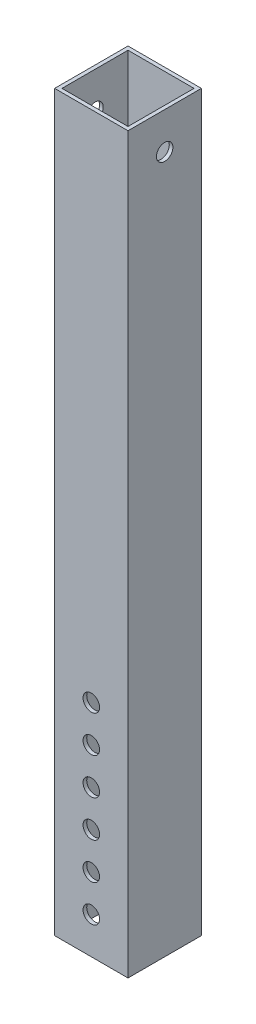
ISO-10303-21;
HEADER;
FILE_DESCRIPTION(('STEP AP214'),'2;1');
FILE_NAME('part.step','',(''),(''),'','','');
FILE_SCHEMA(('AUTOMOTIVE_DESIGN { 1 0 10303 214 1 1 1 1 }'));
ENDSEC;
DATA;
#1=APPLICATION_CONTEXT('core data for automotive mechanical design processes');
#2=APPLICATION_PROTOCOL_DEFINITION('international standard','automotive_design',2000,#1);
#3=PRODUCT_CONTEXT('',#1,'mechanical');
#4=PRODUCT('Part','Part','',(#3));
#5=PRODUCT_RELATED_PRODUCT_CATEGORY('part','',(#4));
#6=PRODUCT_DEFINITION_FORMATION('','',#4);
#7=PRODUCT_DEFINITION_CONTEXT('part definition',#1,'design');
#8=PRODUCT_DEFINITION('design','',#6,#7);
#9=PRODUCT_DEFINITION_SHAPE('','',#8);
#10=(LENGTH_UNIT() NAMED_UNIT(*) SI_UNIT(.MILLI.,.METRE.));
#11=(NAMED_UNIT(*) PLANE_ANGLE_UNIT() SI_UNIT($,.RADIAN.));
#12=(NAMED_UNIT(*) SI_UNIT($,.STERADIAN.) SOLID_ANGLE_UNIT());
#13=UNCERTAINTY_MEASURE_WITH_UNIT(LENGTH_MEASURE(1.E-05),#10,'distance_accuracy_value','');
#14=(GEOMETRIC_REPRESENTATION_CONTEXT(3) GLOBAL_UNCERTAINTY_ASSIGNED_CONTEXT((#13)) GLOBAL_UNIT_ASSIGNED_CONTEXT((#10,
#11,#12)) REPRESENTATION_CONTEXT('',''));
#15=CARTESIAN_POINT('',(0.,0.,0.));
#16=DIRECTION('',(0.,0.,1.));
#17=DIRECTION('',(1.,0.,0.));
#18=AXIS2_PLACEMENT_3D('',#15,#16,#17);
#19=CARTESIAN_POINT('',(0.,200.,0.));
#20=DIRECTION('',(0.,-1.,0.));
#21=DIRECTION('',(0.,0.,-1.));
#22=AXIS2_PLACEMENT_3D('',#19,#20,#21);
#23=PLANE('',#22);
#24=DIRECTION('',(0.,0.,-1.));
#25=VECTOR('',#24,1.);
#26=CARTESIAN_POINT('',(10.,200.,10.));
#27=LINE('',#26,#25);
#28=CARTESIAN_POINT('',(10.,200.,10.));
#29=VERTEX_POINT('',#28);
#30=CARTESIAN_POINT('',(10.,200.,-10.));
#31=VERTEX_POINT('',#30);
#32=EDGE_CURVE('E144',#29,#31,#27,.T.);
#33=ORIENTED_EDGE('',*,*,#32,.T.);
#34=DIRECTION('',(-1.,0.,0.));
#35=VECTOR('',#34,1.);
#36=CARTESIAN_POINT('',(-10.,200.,-10.));
#37=LINE('',#36,#35);
#38=CARTESIAN_POINT('',(-10.,200.,-10.));
#39=VERTEX_POINT('',#38);
#40=EDGE_CURVE('E147',#31,#39,#37,.T.);
#41=ORIENTED_EDGE('',*,*,#40,.T.);
#42=DIRECTION('',(0.,0.,1.));
#43=VECTOR('',#42,1.);
#44=CARTESIAN_POINT('',(-10.,200.,10.));
#45=LINE('',#44,#43);
#46=CARTESIAN_POINT('',(-10.,200.,10.));
#47=VERTEX_POINT('',#46);
#48=EDGE_CURVE('E150',#39,#47,#45,.T.);
#49=ORIENTED_EDGE('',*,*,#48,.T.);
#50=DIRECTION('',(1.,0.,0.));
#51=VECTOR('',#50,1.);
#52=CARTESIAN_POINT('',(-10.,200.,10.));
#53=LINE('',#52,#51);
#54=EDGE_CURVE('E152',#47,#29,#53,.T.);
#55=ORIENTED_EDGE('',*,*,#54,.T.);
#56=EDGE_LOOP('',(#33,#41,#49,#55));
#57=FACE_BOUND('',#56,.T.);
#58=DIRECTION('',(1.,0.,0.));
#59=VECTOR('',#58,1.);
#60=CARTESIAN_POINT('',(-9.,200.,9.));
#61=LINE('',#60,#59);
#62=CARTESIAN_POINT('',(-9.,200.,9.));
#63=VERTEX_POINT('',#62);
#64=CARTESIAN_POINT('',(9.,200.,9.));
#65=VERTEX_POINT('',#64);
#66=EDGE_CURVE('E106',#63,#65,#61,.T.);
#67=ORIENTED_EDGE('',*,*,#66,.F.);
#68=DIRECTION('',(0.,0.,1.));
#69=VECTOR('',#68,1.);
#70=CARTESIAN_POINT('',(-9.,200.,9.));
#71=LINE('',#70,#69);
#72=CARTESIAN_POINT('',(-9.,200.,-9.));
#73=VERTEX_POINT('',#72);
#74=EDGE_CURVE('E128',#73,#63,#71,.T.);
#75=ORIENTED_EDGE('',*,*,#74,.F.);
#76=DIRECTION('',(-1.,0.,0.));
#77=VECTOR('',#76,1.);
#78=CARTESIAN_POINT('',(-9.,200.,-9.));
#79=LINE('',#78,#77);
#80=CARTESIAN_POINT('',(9.,200.,-9.));
#81=VERTEX_POINT('',#80);
#82=EDGE_CURVE('E126',#81,#73,#79,.T.);
#83=ORIENTED_EDGE('',*,*,#82,.F.);
#84=DIRECTION('',(0.,0.,-1.));
#85=VECTOR('',#84,1.);
#86=CARTESIAN_POINT('',(9.,200.,9.));
#87=LINE('',#86,#85);
#88=EDGE_CURVE('E114',#65,#81,#87,.T.);
#89=ORIENTED_EDGE('',*,*,#88,.F.);
#90=EDGE_LOOP('',(#67,#75,#83,#89));
#91=FACE_BOUND('',#90,.T.);
#92=ADVANCED_FACE('F39',(#57,#91),#23,.F.);
#93=CARTESIAN_POINT('',(0.,0.,0.));
#94=DIRECTION('',(0.,-1.,0.));
#95=DIRECTION('',(0.,0.,-1.));
#96=AXIS2_PLACEMENT_3D('',#93,#94,#95);
#97=PLANE('',#96);
#98=DIRECTION('',(0.,0.,-1.));
#99=VECTOR('',#98,1.);
#100=CARTESIAN_POINT('',(10.,0.,10.));
#101=LINE('',#100,#99);
#102=CARTESIAN_POINT('',(10.,0.,10.));
#103=VERTEX_POINT('',#102);
#104=CARTESIAN_POINT('',(10.,0.,-10.));
#105=VERTEX_POINT('',#104);
#106=EDGE_CURVE('E122',#103,#105,#101,.T.);
#107=ORIENTED_EDGE('',*,*,#106,.F.);
#108=DIRECTION('',(1.,0.,0.));
#109=VECTOR('',#108,1.);
#110=CARTESIAN_POINT('',(-10.,0.,10.));
#111=LINE('',#110,#109);
#112=CARTESIAN_POINT('',(-10.,0.,10.));
#113=VERTEX_POINT('',#112);
#114=EDGE_CURVE('E148',#113,#103,#111,.T.);
#115=ORIENTED_EDGE('',*,*,#114,.F.);
#116=DIRECTION('',(0.,0.,1.));
#117=VECTOR('',#116,1.);
#118=CARTESIAN_POINT('',(-10.,0.,10.));
#119=LINE('',#118,#117);
#120=CARTESIAN_POINT('',(-10.,0.,-10.));
#121=VERTEX_POINT('',#120);
#122=EDGE_CURVE('E159',#121,#113,#119,.T.);
#123=ORIENTED_EDGE('',*,*,#122,.F.);
#124=DIRECTION('',(-1.,0.,0.));
#125=VECTOR('',#124,1.);
#126=CARTESIAN_POINT('',(-10.,0.,-10.));
#127=LINE('',#126,#125);
#128=EDGE_CURVE('E157',#105,#121,#127,.T.);
#129=ORIENTED_EDGE('',*,*,#128,.F.);
#130=EDGE_LOOP('',(#107,#115,#123,#129));
#131=FACE_BOUND('',#130,.T.);
#132=DIRECTION('',(0.,0.,1.));
#133=VECTOR('',#132,1.);
#134=CARTESIAN_POINT('',(-9.,0.,9.));
#135=LINE('',#134,#133);
#136=CARTESIAN_POINT('',(-9.,0.,-9.));
#137=VERTEX_POINT('',#136);
#138=CARTESIAN_POINT('',(-9.,0.,9.));
#139=VERTEX_POINT('',#138);
#140=EDGE_CURVE('E115',#137,#139,#135,.T.);
#141=ORIENTED_EDGE('',*,*,#140,.T.);
#142=DIRECTION('',(1.,0.,0.));
#143=VECTOR('',#142,1.);
#144=CARTESIAN_POINT('',(-9.,0.,9.));
#145=LINE('',#144,#143);
#146=CARTESIAN_POINT('',(9.,0.,9.));
#147=VERTEX_POINT('',#146);
#148=EDGE_CURVE('E64',#139,#147,#145,.T.);
#149=ORIENTED_EDGE('',*,*,#148,.T.);
#150=DIRECTION('',(0.,0.,-1.));
#151=VECTOR('',#150,1.);
#152=CARTESIAN_POINT('',(9.,0.,9.));
#153=LINE('',#152,#151);
#154=CARTESIAN_POINT('',(9.,0.,-9.));
#155=VERTEX_POINT('',#154);
#156=EDGE_CURVE('E121',#147,#155,#153,.T.);
#157=ORIENTED_EDGE('',*,*,#156,.T.);
#158=DIRECTION('',(-1.,0.,0.));
#159=VECTOR('',#158,1.);
#160=CARTESIAN_POINT('',(-9.,0.,-9.));
#161=LINE('',#160,#159);
#162=EDGE_CURVE('E136',#155,#137,#161,.T.);
#163=ORIENTED_EDGE('',*,*,#162,.T.);
#164=EDGE_LOOP('',(#141,#149,#157,#163));
#165=FACE_BOUND('',#164,.T.);
#166=ADVANCED_FACE('F265',(#131,#165),#97,.T.);
#167=CARTESIAN_POINT('',(10.,200.,10.));
#168=DIRECTION('',(-1.,0.,0.));
#169=DIRECTION('',(0.,0.,1.));
#170=AXIS2_PLACEMENT_3D('',#167,#168,#169);
#171=PLANE('',#170);
#172=CARTESIAN_POINT('',(10.,190.,0.));
#173=DIRECTION('',(1.,0.,0.));
#174=DIRECTION('',(0.,0.,-1.));
#175=AXIS2_PLACEMENT_3D('',#172,#173,#174);
#176=CIRCLE('',#175,2.25000000000002);
#177=CARTESIAN_POINT('',(10.,190.,-2.25000000000002));
#178=VERTEX_POINT('',#177);
#179=EDGE_CURVE('E245',#178,#178,#176,.T.);
#180=ORIENTED_EDGE('',*,*,#179,.F.);
#181=EDGE_LOOP('',(#180));
#182=FACE_BOUND('',#181,.T.);
#183=ORIENTED_EDGE('',*,*,#106,.T.);
#184=DIRECTION('',(0.,-1.,0.));
#185=VECTOR('',#184,1.);
#186=CARTESIAN_POINT('',(10.,200.,-10.));
#187=LINE('',#186,#185);
#188=EDGE_CURVE('E11',#31,#105,#187,.T.);
#189=ORIENTED_EDGE('',*,*,#188,.F.);
#190=ORIENTED_EDGE('',*,*,#32,.F.);
#191=DIRECTION('',(0.,-1.,0.));
#192=VECTOR('',#191,1.);
#193=CARTESIAN_POINT('',(10.,200.,10.));
#194=LINE('',#193,#192);
#195=EDGE_CURVE('E154',#29,#103,#194,.T.);
#196=ORIENTED_EDGE('',*,*,#195,.T.);
#197=EDGE_LOOP('',(#183,#189,#190,#196));
#198=FACE_BOUND('',#197,.T.);
#199=ADVANCED_FACE('F41',(#182,#198),#171,.F.);
#200=CARTESIAN_POINT('',(-10.,200.,-10.));
#201=DIRECTION('',(0.,0.,1.));
#202=DIRECTION('',(1.,0.,0.));
#203=AXIS2_PLACEMENT_3D('',#200,#201,#202);
#204=PLANE('',#203);
#205=CARTESIAN_POINT('',(0.,10.,-10.));
#206=DIRECTION('',(0.,0.,1.));
#207=DIRECTION('',(1.,0.,0.));
#208=AXIS2_PLACEMENT_3D('',#205,#206,#207);
#209=CIRCLE('',#208,2.25);
#210=CARTESIAN_POINT('',(2.25,10.,-10.));
#211=VERTEX_POINT('',#210);
#212=EDGE_CURVE('E173',#211,#211,#209,.T.);
#213=ORIENTED_EDGE('',*,*,#212,.T.);
#214=EDGE_LOOP('',(#213));
#215=FACE_BOUND('',#214,.T.);
#216=CARTESIAN_POINT('',(0.,20.,-10.));
#217=DIRECTION('',(0.,0.,1.));
#218=DIRECTION('',(1.,0.,0.));
#219=AXIS2_PLACEMENT_3D('',#216,#217,#218);
#220=CIRCLE('',#219,2.25);
#221=CARTESIAN_POINT('',(2.25,20.,-10.));
#222=VERTEX_POINT('',#221);
#223=EDGE_CURVE('E232',#222,#222,#220,.T.);
#224=ORIENTED_EDGE('',*,*,#223,.T.);
#225=EDGE_LOOP('',(#224));
#226=FACE_BOUND('',#225,.T.);
#227=CARTESIAN_POINT('',(0.,30.,-10.));
#228=DIRECTION('',(0.,0.,1.));
#229=DIRECTION('',(1.,0.,0.));
#230=AXIS2_PLACEMENT_3D('',#227,#228,#229);
#231=CIRCLE('',#230,2.25);
#232=CARTESIAN_POINT('',(2.25,30.,-10.));
#233=VERTEX_POINT('',#232);
#234=EDGE_CURVE('E226',#233,#233,#231,.T.);
#235=ORIENTED_EDGE('',*,*,#234,.T.);
#236=EDGE_LOOP('',(#235));
#237=FACE_BOUND('',#236,.T.);
#238=CARTESIAN_POINT('',(0.,40.,-10.));
#239=DIRECTION('',(0.,0.,1.));
#240=DIRECTION('',(1.,0.,0.));
#241=AXIS2_PLACEMENT_3D('',#238,#239,#240);
#242=CIRCLE('',#241,2.25);
#243=CARTESIAN_POINT('',(2.25,40.,-10.));
#244=VERTEX_POINT('',#243);
#245=EDGE_CURVE('E220',#244,#244,#242,.T.);
#246=ORIENTED_EDGE('',*,*,#245,.T.);
#247=EDGE_LOOP('',(#246));
#248=FACE_BOUND('',#247,.T.);
#249=CARTESIAN_POINT('',(0.,50.,-10.));
#250=DIRECTION('',(0.,0.,1.));
#251=DIRECTION('',(1.,0.,0.));
#252=AXIS2_PLACEMENT_3D('',#249,#250,#251);
#253=CIRCLE('',#252,2.25);
#254=CARTESIAN_POINT('',(2.25,50.,-10.));
#255=VERTEX_POINT('',#254);
#256=EDGE_CURVE('E214',#255,#255,#253,.T.);
#257=ORIENTED_EDGE('',*,*,#256,.T.);
#258=EDGE_LOOP('',(#257));
#259=FACE_BOUND('',#258,.T.);
#260=CARTESIAN_POINT('',(0.,60.,-10.));
#261=DIRECTION('',(0.,0.,1.));
#262=DIRECTION('',(1.,0.,0.));
#263=AXIS2_PLACEMENT_3D('',#260,#261,#262);
#264=CIRCLE('',#263,2.25);
#265=CARTESIAN_POINT('',(2.25,60.,-10.));
#266=VERTEX_POINT('',#265);
#267=EDGE_CURVE('E207',#266,#266,#264,.T.);
#268=ORIENTED_EDGE('',*,*,#267,.T.);
#269=EDGE_LOOP('',(#268));
#270=FACE_BOUND('',#269,.T.);
#271=ORIENTED_EDGE('',*,*,#128,.T.);
#272=DIRECTION('',(0.,-1.,0.));
#273=VECTOR('',#272,1.);
#274=CARTESIAN_POINT('',(-10.,200.,-10.));
#275=LINE('',#274,#273);
#276=EDGE_CURVE('E48',#39,#121,#275,.T.);
#277=ORIENTED_EDGE('',*,*,#276,.F.);
#278=ORIENTED_EDGE('',*,*,#40,.F.);
#279=ORIENTED_EDGE('',*,*,#188,.T.);
#280=EDGE_LOOP('',(#271,#277,#278,#279));
#281=FACE_BOUND('',#280,.T.);
#282=ADVANCED_FACE('F292',(#215,#226,#237,#248,#259,#270,#281),#204,.F.);
#283=CARTESIAN_POINT('',(-10.,200.,10.));
#284=DIRECTION('',(1.,0.,0.));
#285=DIRECTION('',(0.,0.,-1.));
#286=AXIS2_PLACEMENT_3D('',#283,#284,#285);
#287=PLANE('',#286);
#288=CARTESIAN_POINT('',(-10.,190.,0.));
#289=DIRECTION('',(1.,0.,0.));
#290=DIRECTION('',(0.,0.,-1.));
#291=AXIS2_PLACEMENT_3D('',#288,#289,#290);
#292=CIRCLE('',#291,2.25000000000002);
#293=CARTESIAN_POINT('',(-10.,190.,-2.25000000000002));
#294=VERTEX_POINT('',#293);
#295=EDGE_CURVE('E248',#294,#294,#292,.T.);
#296=ORIENTED_EDGE('',*,*,#295,.T.);
#297=EDGE_LOOP('',(#296));
#298=FACE_BOUND('',#297,.T.);
#299=ORIENTED_EDGE('',*,*,#122,.T.);
#300=DIRECTION('',(0.,-1.,0.));
#301=VECTOR('',#300,1.);
#302=CARTESIAN_POINT('',(-10.,200.,10.));
#303=LINE('',#302,#301);
#304=EDGE_CURVE('E164',#47,#113,#303,.T.);
#305=ORIENTED_EDGE('',*,*,#304,.F.);
#306=ORIENTED_EDGE('',*,*,#48,.F.);
#307=ORIENTED_EDGE('',*,*,#276,.T.);
#308=EDGE_LOOP('',(#299,#305,#306,#307));
#309=FACE_BOUND('',#308,.T.);
#310=ADVANCED_FACE('F289',(#298,#309),#287,.F.);
#311=CARTESIAN_POINT('',(-10.,200.,10.));
#312=DIRECTION('',(0.,0.,-1.));
#313=DIRECTION('',(-1.,0.,0.));
#314=AXIS2_PLACEMENT_3D('',#311,#312,#313);
#315=PLANE('',#314);
#316=CARTESIAN_POINT('',(0.,10.,10.));
#317=DIRECTION('',(0.,0.,1.));
#318=DIRECTION('',(1.,0.,0.));
#319=AXIS2_PLACEMENT_3D('',#316,#317,#318);
#320=CIRCLE('',#319,2.25);
#321=CARTESIAN_POINT('',(2.25,10.,10.));
#322=VERTEX_POINT('',#321);
#323=EDGE_CURVE('E238',#322,#322,#320,.T.);
#324=ORIENTED_EDGE('',*,*,#323,.F.);
#325=EDGE_LOOP('',(#324));
#326=FACE_BOUND('',#325,.T.);
#327=CARTESIAN_POINT('',(0.,20.,10.));
#328=DIRECTION('',(0.,0.,1.));
#329=DIRECTION('',(1.,0.,0.));
#330=AXIS2_PLACEMENT_3D('',#327,#328,#329);
#331=CIRCLE('',#330,2.25);
#332=CARTESIAN_POINT('',(2.25,20.,10.));
#333=VERTEX_POINT('',#332);
#334=EDGE_CURVE('E235',#333,#333,#331,.T.);
#335=ORIENTED_EDGE('',*,*,#334,.F.);
#336=EDGE_LOOP('',(#335));
#337=FACE_BOUND('',#336,.T.);
#338=CARTESIAN_POINT('',(0.,30.,10.));
#339=DIRECTION('',(0.,0.,1.));
#340=DIRECTION('',(1.,0.,0.));
#341=AXIS2_PLACEMENT_3D('',#338,#339,#340);
#342=CIRCLE('',#341,2.25);
#343=CARTESIAN_POINT('',(2.25,30.,10.));
#344=VERTEX_POINT('',#343);
#345=EDGE_CURVE('E229',#344,#344,#342,.T.);
#346=ORIENTED_EDGE('',*,*,#345,.F.);
#347=EDGE_LOOP('',(#346));
#348=FACE_BOUND('',#347,.T.);
#349=CARTESIAN_POINT('',(0.,40.,10.));
#350=DIRECTION('',(0.,0.,1.));
#351=DIRECTION('',(1.,0.,0.));
#352=AXIS2_PLACEMENT_3D('',#349,#350,#351);
#353=CIRCLE('',#352,2.25);
#354=CARTESIAN_POINT('',(2.25,40.,10.));
#355=VERTEX_POINT('',#354);
#356=EDGE_CURVE('E223',#355,#355,#353,.T.);
#357=ORIENTED_EDGE('',*,*,#356,.F.);
#358=EDGE_LOOP('',(#357));
#359=FACE_BOUND('',#358,.T.);
#360=CARTESIAN_POINT('',(0.,50.,10.));
#361=DIRECTION('',(0.,0.,1.));
#362=DIRECTION('',(1.,0.,0.));
#363=AXIS2_PLACEMENT_3D('',#360,#361,#362);
#364=CIRCLE('',#363,2.25);
#365=CARTESIAN_POINT('',(2.25,50.,10.));
#366=VERTEX_POINT('',#365);
#367=EDGE_CURVE('E217',#366,#366,#364,.T.);
#368=ORIENTED_EDGE('',*,*,#367,.F.);
#369=EDGE_LOOP('',(#368));
#370=FACE_BOUND('',#369,.T.);
#371=CARTESIAN_POINT('',(0.,60.,10.));
#372=DIRECTION('',(0.,0.,1.));
#373=DIRECTION('',(1.,0.,0.));
#374=AXIS2_PLACEMENT_3D('',#371,#372,#373);
#375=CIRCLE('',#374,2.25);
#376=CARTESIAN_POINT('',(2.25,60.,10.));
#377=VERTEX_POINT('',#376);
#378=EDGE_CURVE('E210',#377,#377,#375,.T.);
#379=ORIENTED_EDGE('',*,*,#378,.F.);
#380=EDGE_LOOP('',(#379));
#381=FACE_BOUND('',#380,.T.);
#382=ORIENTED_EDGE('',*,*,#114,.T.);
#383=ORIENTED_EDGE('',*,*,#195,.F.);
#384=ORIENTED_EDGE('',*,*,#54,.F.);
#385=ORIENTED_EDGE('',*,*,#304,.T.);
#386=EDGE_LOOP('',(#382,#383,#384,#385));
#387=FACE_BOUND('',#386,.T.);
#388=ADVANCED_FACE('F286',(#326,#337,#348,#359,#370,#381,#387),#315,.F.);
#389=CARTESIAN_POINT('',(-9.,200.,9.));
#390=DIRECTION('',(0.,0.,-1.));
#391=DIRECTION('',(-1.,0.,0.));
#392=AXIS2_PLACEMENT_3D('',#389,#390,#391);
#393=PLANE('',#392);
#394=CARTESIAN_POINT('',(0.,10.,9.));
#395=DIRECTION('',(0.,0.,-1.));
#396=DIRECTION('',(-1.,0.,0.));
#397=AXIS2_PLACEMENT_3D('',#394,#395,#396);
#398=CIRCLE('',#397,2.25);
#399=CARTESIAN_POINT('',(-2.25,10.,9.));
#400=VERTEX_POINT('',#399);
#401=EDGE_CURVE('E134',#400,#400,#398,.T.);
#402=ORIENTED_EDGE('',*,*,#401,.F.);
#403=EDGE_LOOP('',(#402));
#404=FACE_BOUND('',#403,.T.);
#405=CARTESIAN_POINT('',(0.,20.,9.));
#406=DIRECTION('',(0.,0.,-1.));
#407=DIRECTION('',(-1.,0.,0.));
#408=AXIS2_PLACEMENT_3D('',#405,#406,#407);
#409=CIRCLE('',#408,2.25);
#410=CARTESIAN_POINT('',(-2.25,20.,9.));
#411=VERTEX_POINT('',#410);
#412=EDGE_CURVE('E188',#411,#411,#409,.T.);
#413=ORIENTED_EDGE('',*,*,#412,.F.);
#414=EDGE_LOOP('',(#413));
#415=FACE_BOUND('',#414,.T.);
#416=CARTESIAN_POINT('',(0.,30.,9.));
#417=DIRECTION('',(0.,0.,-1.));
#418=DIRECTION('',(-1.,0.,0.));
#419=AXIS2_PLACEMENT_3D('',#416,#417,#418);
#420=CIRCLE('',#419,2.25);
#421=CARTESIAN_POINT('',(-2.25,30.,9.));
#422=VERTEX_POINT('',#421);
#423=EDGE_CURVE('E185',#422,#422,#420,.T.);
#424=ORIENTED_EDGE('',*,*,#423,.F.);
#425=EDGE_LOOP('',(#424));
#426=FACE_BOUND('',#425,.T.);
#427=CARTESIAN_POINT('',(0.,40.,9.));
#428=DIRECTION('',(0.,0.,-1.));
#429=DIRECTION('',(-1.,0.,0.));
#430=AXIS2_PLACEMENT_3D('',#427,#428,#429);
#431=CIRCLE('',#430,2.25);
#432=CARTESIAN_POINT('',(-2.25,40.,9.));
#433=VERTEX_POINT('',#432);
#434=EDGE_CURVE('E181',#433,#433,#431,.T.);
#435=ORIENTED_EDGE('',*,*,#434,.F.);
#436=EDGE_LOOP('',(#435));
#437=FACE_BOUND('',#436,.T.);
#438=CARTESIAN_POINT('',(0.,50.,9.));
#439=DIRECTION('',(0.,0.,-1.));
#440=DIRECTION('',(-1.,0.,0.));
#441=AXIS2_PLACEMENT_3D('',#438,#439,#440);
#442=CIRCLE('',#441,2.25);
#443=CARTESIAN_POINT('',(-2.25,50.,9.));
#444=VERTEX_POINT('',#443);
#445=EDGE_CURVE('E177',#444,#444,#442,.T.);
#446=ORIENTED_EDGE('',*,*,#445,.F.);
#447=EDGE_LOOP('',(#446));
#448=FACE_BOUND('',#447,.T.);
#449=CARTESIAN_POINT('',(0.,60.,9.));
#450=DIRECTION('',(0.,0.,-1.));
#451=DIRECTION('',(-1.,0.,0.));
#452=AXIS2_PLACEMENT_3D('',#449,#450,#451);
#453=CIRCLE('',#452,2.25);
#454=CARTESIAN_POINT('',(-2.25,60.,9.));
#455=VERTEX_POINT('',#454);
#456=EDGE_CURVE('E172',#455,#455,#453,.T.);
#457=ORIENTED_EDGE('',*,*,#456,.F.);
#458=EDGE_LOOP('',(#457));
#459=FACE_BOUND('',#458,.T.);
#460=ORIENTED_EDGE('',*,*,#148,.F.);
#461=DIRECTION('',(0.,-1.,0.));
#462=VECTOR('',#461,1.);
#463=CARTESIAN_POINT('',(-9.,200.,9.));
#464=LINE('',#463,#462);
#465=EDGE_CURVE('E110',#63,#139,#464,.T.);
#466=ORIENTED_EDGE('',*,*,#465,.F.);
#467=ORIENTED_EDGE('',*,*,#66,.T.);
#468=DIRECTION('',(0.,-1.,0.));
#469=VECTOR('',#468,1.);
#470=CARTESIAN_POINT('',(9.,200.,9.));
#471=LINE('',#470,#469);
#472=EDGE_CURVE('E109',#65,#147,#471,.T.);
#473=ORIENTED_EDGE('',*,*,#472,.T.);
#474=EDGE_LOOP('',(#460,#466,#467,#473));
#475=FACE_BOUND('',#474,.T.);
#476=ADVANCED_FACE('F108',(#404,#415,#426,#437,#448,#459,#475),#393,.T.);
#477=CARTESIAN_POINT('',(9.,200.,9.));
#478=DIRECTION('',(-1.,0.,0.));
#479=DIRECTION('',(0.,0.,1.));
#480=AXIS2_PLACEMENT_3D('',#477,#478,#479);
#481=PLANE('',#480);
#482=CARTESIAN_POINT('',(9.,190.,0.));
#483=DIRECTION('',(-1.,0.,0.));
#484=DIRECTION('',(0.,0.,1.));
#485=AXIS2_PLACEMENT_3D('',#482,#483,#484);
#486=CIRCLE('',#485,2.25000000000002);
#487=CARTESIAN_POINT('',(9.,190.,2.25000000000002));
#488=VERTEX_POINT('',#487);
#489=EDGE_CURVE('E211',#488,#488,#486,.T.);
#490=ORIENTED_EDGE('',*,*,#489,.F.);
#491=EDGE_LOOP('',(#490));
#492=FACE_BOUND('',#491,.T.);
#493=ORIENTED_EDGE('',*,*,#156,.F.);
#494=ORIENTED_EDGE('',*,*,#472,.F.);
#495=ORIENTED_EDGE('',*,*,#88,.T.);
#496=DIRECTION('',(0.,-1.,0.));
#497=VECTOR('',#496,1.);
#498=CARTESIAN_POINT('',(9.,200.,-9.));
#499=LINE('',#498,#497);
#500=EDGE_CURVE('E123',#81,#155,#499,.T.);
#501=ORIENTED_EDGE('',*,*,#500,.T.);
#502=EDGE_LOOP('',(#493,#494,#495,#501));
#503=FACE_BOUND('',#502,.T.);
#504=ADVANCED_FACE('F118',(#492,#503),#481,.T.);
#505=CARTESIAN_POINT('',(-9.,200.,-9.));
#506=DIRECTION('',(0.,0.,1.));
#507=DIRECTION('',(1.,0.,0.));
#508=AXIS2_PLACEMENT_3D('',#505,#506,#507);
#509=PLANE('',#508);
#510=CARTESIAN_POINT('',(0.,10.,-9.));
#511=DIRECTION('',(0.,0.,1.));
#512=DIRECTION('',(1.,0.,0.));
#513=AXIS2_PLACEMENT_3D('',#510,#511,#512);
#514=CIRCLE('',#513,2.25);
#515=CARTESIAN_POINT('',(2.25,10.,-9.));
#516=VERTEX_POINT('',#515);
#517=EDGE_CURVE('E189',#516,#516,#514,.T.);
#518=ORIENTED_EDGE('',*,*,#517,.F.);
#519=EDGE_LOOP('',(#518));
#520=FACE_BOUND('',#519,.T.);
#521=CARTESIAN_POINT('',(0.,20.,-9.));
#522=DIRECTION('',(0.,0.,1.));
#523=DIRECTION('',(1.,0.,0.));
#524=AXIS2_PLACEMENT_3D('',#521,#522,#523);
#525=CIRCLE('',#524,2.25);
#526=CARTESIAN_POINT('',(2.25,20.,-9.));
#527=VERTEX_POINT('',#526);
#528=EDGE_CURVE('E186',#527,#527,#525,.T.);
#529=ORIENTED_EDGE('',*,*,#528,.F.);
#530=EDGE_LOOP('',(#529));
#531=FACE_BOUND('',#530,.T.);
#532=CARTESIAN_POINT('',(0.,30.,-9.));
#533=DIRECTION('',(0.,0.,1.));
#534=DIRECTION('',(1.,0.,0.));
#535=AXIS2_PLACEMENT_3D('',#532,#533,#534);
#536=CIRCLE('',#535,2.25);
#537=CARTESIAN_POINT('',(2.25,30.,-9.));
#538=VERTEX_POINT('',#537);
#539=EDGE_CURVE('E182',#538,#538,#536,.T.);
#540=ORIENTED_EDGE('',*,*,#539,.F.);
#541=EDGE_LOOP('',(#540));
#542=FACE_BOUND('',#541,.T.);
#543=CARTESIAN_POINT('',(0.,40.,-9.));
#544=DIRECTION('',(0.,0.,1.));
#545=DIRECTION('',(1.,0.,0.));
#546=AXIS2_PLACEMENT_3D('',#543,#544,#545);
#547=CIRCLE('',#546,2.25);
#548=CARTESIAN_POINT('',(2.25,40.,-9.));
#549=VERTEX_POINT('',#548);
#550=EDGE_CURVE('E178',#549,#549,#547,.T.);
#551=ORIENTED_EDGE('',*,*,#550,.F.);
#552=EDGE_LOOP('',(#551));
#553=FACE_BOUND('',#552,.T.);
#554=CARTESIAN_POINT('',(0.,50.,-9.));
#555=DIRECTION('',(0.,0.,1.));
#556=DIRECTION('',(1.,0.,0.));
#557=AXIS2_PLACEMENT_3D('',#554,#555,#556);
#558=CIRCLE('',#557,2.25);
#559=CARTESIAN_POINT('',(2.25,50.,-9.));
#560=VERTEX_POINT('',#559);
#561=EDGE_CURVE('E174',#560,#560,#558,.T.);
#562=ORIENTED_EDGE('',*,*,#561,.F.);
#563=EDGE_LOOP('',(#562));
#564=FACE_BOUND('',#563,.T.);
#565=CARTESIAN_POINT('',(0.,60.,-9.));
#566=DIRECTION('',(0.,0.,1.));
#567=DIRECTION('',(1.,0.,0.));
#568=AXIS2_PLACEMENT_3D('',#565,#566,#567);
#569=CIRCLE('',#568,2.25);
#570=CARTESIAN_POINT('',(2.25,60.,-9.));
#571=VERTEX_POINT('',#570);
#572=EDGE_CURVE('E169',#571,#571,#569,.T.);
#573=ORIENTED_EDGE('',*,*,#572,.F.);
#574=EDGE_LOOP('',(#573));
#575=FACE_BOUND('',#574,.T.);
#576=ORIENTED_EDGE('',*,*,#162,.F.);
#577=ORIENTED_EDGE('',*,*,#500,.F.);
#578=ORIENTED_EDGE('',*,*,#82,.T.);
#579=DIRECTION('',(0.,-1.,0.));
#580=VECTOR('',#579,1.);
#581=CARTESIAN_POINT('',(-9.,200.,-9.));
#582=LINE('',#581,#580);
#583=EDGE_CURVE('E56',#73,#137,#582,.T.);
#584=ORIENTED_EDGE('',*,*,#583,.T.);
#585=EDGE_LOOP('',(#576,#577,#578,#584));
#586=FACE_BOUND('',#585,.T.);
#587=ADVANCED_FACE('F261',(#520,#531,#542,#553,#564,#575,#586),#509,.T.);
#588=CARTESIAN_POINT('',(-9.,200.,9.));
#589=DIRECTION('',(1.,0.,0.));
#590=DIRECTION('',(0.,0.,-1.));
#591=AXIS2_PLACEMENT_3D('',#588,#589,#590);
#592=PLANE('',#591);
#593=CARTESIAN_POINT('',(-9.,190.,0.));
#594=DIRECTION('',(1.,0.,0.));
#595=DIRECTION('',(0.,0.,-1.));
#596=AXIS2_PLACEMENT_3D('',#593,#594,#595);
#597=CIRCLE('',#596,2.25000000000002);
#598=CARTESIAN_POINT('',(-9.,190.,-2.25000000000002));
#599=VERTEX_POINT('',#598);
#600=EDGE_CURVE('E43',#599,#599,#597,.T.);
#601=ORIENTED_EDGE('',*,*,#600,.F.);
#602=EDGE_LOOP('',(#601));
#603=FACE_BOUND('',#602,.T.);
#604=ORIENTED_EDGE('',*,*,#140,.F.);
#605=ORIENTED_EDGE('',*,*,#583,.F.);
#606=ORIENTED_EDGE('',*,*,#74,.T.);
#607=ORIENTED_EDGE('',*,*,#465,.T.);
#608=EDGE_LOOP('',(#604,#605,#606,#607));
#609=FACE_BOUND('',#608,.T.);
#610=ADVANCED_FACE('F258',(#603,#609),#592,.T.);
#611=CARTESIAN_POINT('',(0.,60.,-10.));
#612=DIRECTION('',(0.,0.,1.));
#613=DIRECTION('',(1.,0.,0.));
#614=AXIS2_PLACEMENT_3D('',#611,#612,#613);
#615=CYLINDRICAL_SURFACE('',#614,2.25);
#616=ORIENTED_EDGE('',*,*,#572,.T.);
#617=EDGE_LOOP('',(#616));
#618=FACE_BOUND('',#617,.T.);
#619=ORIENTED_EDGE('',*,*,#267,.F.);
#620=EDGE_LOOP('',(#619));
#621=FACE_BOUND('',#620,.T.);
#622=ADVANCED_FACE('F260',(#618,#621),#615,.F.);
#623=CARTESIAN_POINT('',(0.,50.,-10.));
#624=DIRECTION('',(0.,0.,1.));
#625=DIRECTION('',(1.,0.,0.));
#626=AXIS2_PLACEMENT_3D('',#623,#624,#625);
#627=CYLINDRICAL_SURFACE('',#626,2.25);
#628=ORIENTED_EDGE('',*,*,#561,.T.);
#629=EDGE_LOOP('',(#628));
#630=FACE_BOUND('',#629,.T.);
#631=ORIENTED_EDGE('',*,*,#256,.F.);
#632=EDGE_LOOP('',(#631));
#633=FACE_BOUND('',#632,.T.);
#634=ADVANCED_FACE('F326',(#630,#633),#627,.F.);
#635=CARTESIAN_POINT('',(0.,40.,-10.));
#636=DIRECTION('',(0.,0.,1.));
#637=DIRECTION('',(1.,0.,0.));
#638=AXIS2_PLACEMENT_3D('',#635,#636,#637);
#639=CYLINDRICAL_SURFACE('',#638,2.25);
#640=ORIENTED_EDGE('',*,*,#550,.T.);
#641=EDGE_LOOP('',(#640));
#642=FACE_BOUND('',#641,.T.);
#643=ORIENTED_EDGE('',*,*,#245,.F.);
#644=EDGE_LOOP('',(#643));
#645=FACE_BOUND('',#644,.T.);
#646=ADVANCED_FACE('F333',(#642,#645),#639,.F.);
#647=CARTESIAN_POINT('',(0.,30.,-10.));
#648=DIRECTION('',(0.,0.,1.));
#649=DIRECTION('',(1.,0.,0.));
#650=AXIS2_PLACEMENT_3D('',#647,#648,#649);
#651=CYLINDRICAL_SURFACE('',#650,2.25);
#652=ORIENTED_EDGE('',*,*,#539,.T.);
#653=EDGE_LOOP('',(#652));
#654=FACE_BOUND('',#653,.T.);
#655=ORIENTED_EDGE('',*,*,#234,.F.);
#656=EDGE_LOOP('',(#655));
#657=FACE_BOUND('',#656,.T.);
#658=ADVANCED_FACE('F382',(#654,#657),#651,.F.);
#659=CARTESIAN_POINT('',(0.,20.,-10.));
#660=DIRECTION('',(0.,0.,1.));
#661=DIRECTION('',(1.,0.,0.));
#662=AXIS2_PLACEMENT_3D('',#659,#660,#661);
#663=CYLINDRICAL_SURFACE('',#662,2.25);
#664=ORIENTED_EDGE('',*,*,#528,.T.);
#665=EDGE_LOOP('',(#664));
#666=FACE_BOUND('',#665,.T.);
#667=ORIENTED_EDGE('',*,*,#223,.F.);
#668=EDGE_LOOP('',(#667));
#669=FACE_BOUND('',#668,.T.);
#670=ADVANCED_FACE('F346',(#666,#669),#663,.F.);
#671=CARTESIAN_POINT('',(0.,10.,-10.));
#672=DIRECTION('',(0.,0.,1.));
#673=DIRECTION('',(1.,0.,0.));
#674=AXIS2_PLACEMENT_3D('',#671,#672,#673);
#675=CYLINDRICAL_SURFACE('',#674,2.25);
#676=ORIENTED_EDGE('',*,*,#517,.T.);
#677=EDGE_LOOP('',(#676));
#678=FACE_BOUND('',#677,.T.);
#679=ORIENTED_EDGE('',*,*,#212,.F.);
#680=EDGE_LOOP('',(#679));
#681=FACE_BOUND('',#680,.T.);
#682=ADVANCED_FACE('F338',(#678,#681),#675,.F.);
#683=ORIENTED_EDGE('',*,*,#456,.T.);
#684=EDGE_LOOP('',(#683));
#685=FACE_BOUND('',#684,.T.);
#686=ORIENTED_EDGE('',*,*,#378,.T.);
#687=EDGE_LOOP('',(#686));
#688=FACE_BOUND('',#687,.T.);
#689=ADVANCED_FACE('F329',(#685,#688),#615,.F.);
#690=ORIENTED_EDGE('',*,*,#445,.T.);
#691=EDGE_LOOP('',(#690));
#692=FACE_BOUND('',#691,.T.);
#693=ORIENTED_EDGE('',*,*,#367,.T.);
#694=EDGE_LOOP('',(#693));
#695=FACE_BOUND('',#694,.T.);
#696=ADVANCED_FACE('F336',(#692,#695),#627,.F.);
#697=ORIENTED_EDGE('',*,*,#434,.T.);
#698=EDGE_LOOP('',(#697));
#699=FACE_BOUND('',#698,.T.);
#700=ORIENTED_EDGE('',*,*,#356,.T.);
#701=EDGE_LOOP('',(#700));
#702=FACE_BOUND('',#701,.T.);
#703=ADVANCED_FACE('F344',(#699,#702),#639,.F.);
#704=ORIENTED_EDGE('',*,*,#423,.T.);
#705=EDGE_LOOP('',(#704));
#706=FACE_BOUND('',#705,.T.);
#707=ORIENTED_EDGE('',*,*,#345,.T.);
#708=EDGE_LOOP('',(#707));
#709=FACE_BOUND('',#708,.T.);
#710=ADVANCED_FACE('F372',(#706,#709),#651,.F.);
#711=ORIENTED_EDGE('',*,*,#412,.T.);
#712=EDGE_LOOP('',(#711));
#713=FACE_BOUND('',#712,.T.);
#714=ORIENTED_EDGE('',*,*,#334,.T.);
#715=EDGE_LOOP('',(#714));
#716=FACE_BOUND('',#715,.T.);
#717=ADVANCED_FACE('F379',(#713,#716),#663,.F.);
#718=ORIENTED_EDGE('',*,*,#401,.T.);
#719=EDGE_LOOP('',(#718));
#720=FACE_BOUND('',#719,.T.);
#721=ORIENTED_EDGE('',*,*,#323,.T.);
#722=EDGE_LOOP('',(#721));
#723=FACE_BOUND('',#722,.T.);
#724=ADVANCED_FACE('F348',(#720,#723),#675,.F.);
#725=CARTESIAN_POINT('',(-10.,190.,0.));
#726=DIRECTION('',(1.,0.,0.));
#727=DIRECTION('',(0.,0.,-1.));
#728=AXIS2_PLACEMENT_3D('',#725,#726,#727);
#729=CYLINDRICAL_SURFACE('',#728,2.25000000000002);
#730=ORIENTED_EDGE('',*,*,#600,.T.);
#731=EDGE_LOOP('',(#730));
#732=FACE_BOUND('',#731,.T.);
#733=ORIENTED_EDGE('',*,*,#295,.F.);
#734=EDGE_LOOP('',(#733));
#735=FACE_BOUND('',#734,.T.);
#736=ADVANCED_FACE('F255',(#732,#735),#729,.F.);
#737=ORIENTED_EDGE('',*,*,#489,.T.);
#738=EDGE_LOOP('',(#737));
#739=FACE_BOUND('',#738,.T.);
#740=ORIENTED_EDGE('',*,*,#179,.T.);
#741=EDGE_LOOP('',(#740));
#742=FACE_BOUND('',#741,.T.);
#743=ADVANCED_FACE('F405',(#739,#742),#729,.F.);
#744=CLOSED_SHELL('',(#92,#166,#199,#282,#310,#388,#476,#504,#587,#610,#622,#634,#646,#658,#670,
#682,#689,#696,#703,#710,#717,#724,#736,#743));
#745=MANIFOLD_SOLID_BREP('B2',#744);
#746=ADVANCED_BREP_SHAPE_REPRESENTATION('',(#18,#745),#14);
#747=SHAPE_DEFINITION_REPRESENTATION(#9,#746);
ENDSEC;
END-ISO-10303-21;
